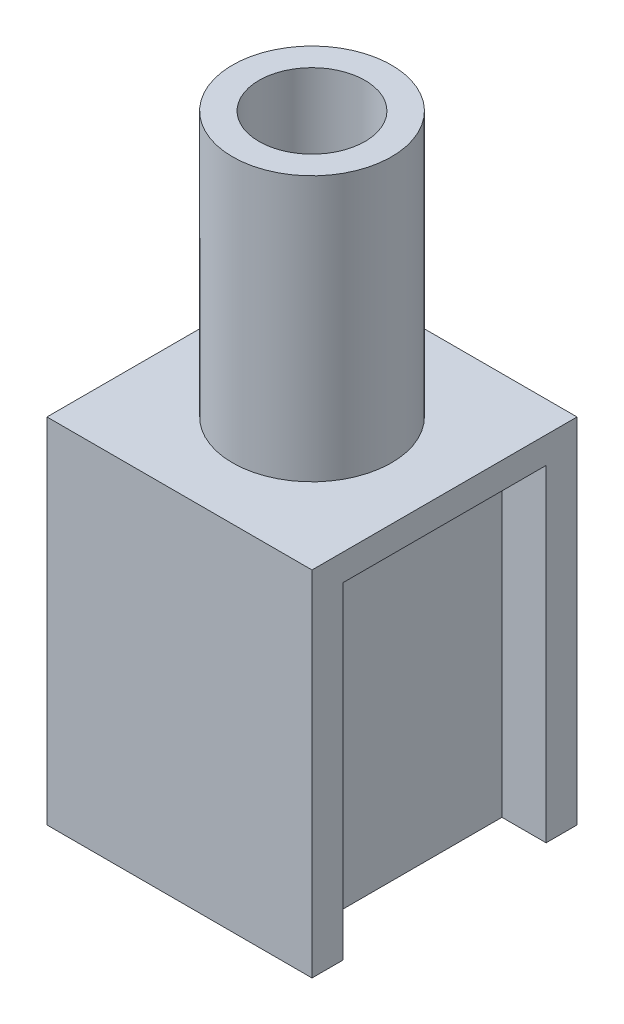
ISO-10303-21;
HEADER;
FILE_DESCRIPTION(('STEP AP214'),'2;1');
FILE_NAME('part.step','',(''),(''),'','','');
FILE_SCHEMA(('AUTOMOTIVE_DESIGN { 1 0 10303 214 1 1 1 1 }'));
ENDSEC;
DATA;
#1=APPLICATION_CONTEXT('core data for automotive mechanical design processes');
#2=APPLICATION_PROTOCOL_DEFINITION('international standard','automotive_design',2000,#1);
#3=PRODUCT_CONTEXT('',#1,'mechanical');
#4=PRODUCT('Part','Part','',(#3));
#5=PRODUCT_RELATED_PRODUCT_CATEGORY('part','',(#4));
#6=PRODUCT_DEFINITION_FORMATION('','',#4);
#7=PRODUCT_DEFINITION_CONTEXT('part definition',#1,'design');
#8=PRODUCT_DEFINITION('design','',#6,#7);
#9=PRODUCT_DEFINITION_SHAPE('','',#8);
#10=(LENGTH_UNIT() NAMED_UNIT(*) SI_UNIT(.MILLI.,.METRE.));
#11=(NAMED_UNIT(*) PLANE_ANGLE_UNIT() SI_UNIT($,.RADIAN.));
#12=(NAMED_UNIT(*) SI_UNIT($,.STERADIAN.) SOLID_ANGLE_UNIT());
#13=UNCERTAINTY_MEASURE_WITH_UNIT(LENGTH_MEASURE(1.E-05),#10,'distance_accuracy_value','');
#14=(GEOMETRIC_REPRESENTATION_CONTEXT(3) GLOBAL_UNCERTAINTY_ASSIGNED_CONTEXT((#13)) GLOBAL_UNIT_ASSIGNED_CONTEXT((#10,
#11,#12)) REPRESENTATION_CONTEXT('',''));
#15=CARTESIAN_POINT('',(0.,0.,0.));
#16=DIRECTION('',(0.,0.,1.));
#17=DIRECTION('',(1.,0.,0.));
#18=AXIS2_PLACEMENT_3D('',#15,#16,#17);
#19=CARTESIAN_POINT('',(0.,0.,0.));
#20=DIRECTION('',(0.,-1.,0.));
#21=DIRECTION('',(0.,0.,-1.));
#22=AXIS2_PLACEMENT_3D('',#19,#20,#21);
#23=PLANE('',#22);
#24=DIRECTION('',(0.,0.,1.));
#25=VECTOR('',#24,1.);
#26=CARTESIAN_POINT('',(-9.99999999999999,0.,-11.5));
#27=LINE('',#26,#25);
#28=CARTESIAN_POINT('',(-9.99999999999999,0.,-11.5));
#29=VERTEX_POINT('',#28);
#30=CARTESIAN_POINT('',(-9.99999999999999,0.,11.5));
#31=VERTEX_POINT('',#30);
#32=EDGE_CURVE('E140',#29,#31,#27,.T.);
#33=ORIENTED_EDGE('',*,*,#32,.F.);
#34=DIRECTION('',(-1.,0.,0.));
#35=VECTOR('',#34,1.);
#36=CARTESIAN_POINT('',(-9.99999999999999,0.,-11.5));
#37=LINE('',#36,#35);
#38=CARTESIAN_POINT('',(-15.,0.,-11.5));
#39=VERTEX_POINT('',#38);
#40=EDGE_CURVE('E162',#29,#39,#37,.T.);
#41=ORIENTED_EDGE('',*,*,#40,.T.);
#42=DIRECTION('',(0.,0.,1.));
#43=VECTOR('',#42,1.);
#44=CARTESIAN_POINT('',(-15.,0.,15.));
#45=LINE('',#44,#43);
#46=CARTESIAN_POINT('',(-15.,0.,-15.));
#47=VERTEX_POINT('',#46);
#48=EDGE_CURVE('E217',#47,#39,#45,.T.);
#49=ORIENTED_EDGE('',*,*,#48,.F.);
#50=DIRECTION('',(-1.,0.,0.));
#51=VECTOR('',#50,1.);
#52=CARTESIAN_POINT('',(-15.,0.,-15.));
#53=LINE('',#52,#51);
#54=CARTESIAN_POINT('',(15.,0.,-15.));
#55=VERTEX_POINT('',#54);
#56=EDGE_CURVE('E214',#55,#47,#53,.T.);
#57=ORIENTED_EDGE('',*,*,#56,.F.);
#58=DIRECTION('',(0.,0.,-1.));
#59=VECTOR('',#58,1.);
#60=CARTESIAN_POINT('',(15.,0.,15.));
#61=LINE('',#60,#59);
#62=CARTESIAN_POINT('',(15.,0.,-11.5));
#63=VERTEX_POINT('',#62);
#64=EDGE_CURVE('E200',#63,#55,#61,.T.);
#65=ORIENTED_EDGE('',*,*,#64,.F.);
#66=DIRECTION('',(1.,0.,0.));
#67=VECTOR('',#66,1.);
#68=CARTESIAN_POINT('',(10.,0.,-11.5));
#69=LINE('',#68,#67);
#70=CARTESIAN_POINT('',(10.,0.,-11.5));
#71=VERTEX_POINT('',#70);
#72=EDGE_CURVE('E181',#71,#63,#69,.T.);
#73=ORIENTED_EDGE('',*,*,#72,.F.);
#74=DIRECTION('',(0.,0.,-1.));
#75=VECTOR('',#74,1.);
#76=CARTESIAN_POINT('',(10.,0.,11.5));
#77=LINE('',#76,#75);
#78=CARTESIAN_POINT('',(10.,0.,11.5));
#79=VERTEX_POINT('',#78);
#80=EDGE_CURVE('E175',#79,#71,#77,.T.);
#81=ORIENTED_EDGE('',*,*,#80,.F.);
#82=DIRECTION('',(1.,0.,0.));
#83=VECTOR('',#82,1.);
#84=CARTESIAN_POINT('',(10.,0.,11.5));
#85=LINE('',#84,#83);
#86=CARTESIAN_POINT('',(15.,0.,11.5));
#87=VERTEX_POINT('',#86);
#88=EDGE_CURVE('E188',#79,#87,#85,.T.);
#89=ORIENTED_EDGE('',*,*,#88,.T.);
#90=CARTESIAN_POINT('',(15.,0.,15.));
#91=VERTEX_POINT('',#90);
#92=EDGE_CURVE('E215',#91,#87,#61,.T.);
#93=ORIENTED_EDGE('',*,*,#92,.F.);
#94=DIRECTION('',(1.,0.,0.));
#95=VECTOR('',#94,1.);
#96=CARTESIAN_POINT('',(-15.,0.,15.));
#97=LINE('',#96,#95);
#98=CARTESIAN_POINT('',(-15.,0.,15.));
#99=VERTEX_POINT('',#98);
#100=EDGE_CURVE('E202',#99,#91,#97,.T.);
#101=ORIENTED_EDGE('',*,*,#100,.F.);
#102=CARTESIAN_POINT('',(-15.,0.,11.5));
#103=VERTEX_POINT('',#102);
#104=EDGE_CURVE('E220',#103,#99,#45,.T.);
#105=ORIENTED_EDGE('',*,*,#104,.F.);
#106=DIRECTION('',(-1.,0.,0.));
#107=VECTOR('',#106,1.);
#108=CARTESIAN_POINT('',(-9.99999999999999,0.,11.5));
#109=LINE('',#108,#107);
#110=EDGE_CURVE('E159',#31,#103,#109,.T.);
#111=ORIENTED_EDGE('',*,*,#110,.F.);
#112=EDGE_LOOP('',(#33,#41,#49,#57,#65,#73,#81,#89,#93,#101,#105,#111));
#113=FACE_BOUND('',#112,.T.);
#114=ADVANCED_FACE('F39',(#113),#23,.T.);
#115=CARTESIAN_POINT('',(-15.,40.,15.));
#116=DIRECTION('',(1.,0.,0.));
#117=DIRECTION('',(0.,0.,-1.));
#118=AXIS2_PLACEMENT_3D('',#115,#116,#117);
#119=PLANE('',#118);
#120=DIRECTION('',(0.,1.,0.));
#121=VECTOR('',#120,1.);
#122=CARTESIAN_POINT('',(-15.,0.,11.5));
#123=LINE('',#122,#121);
#124=CARTESIAN_POINT('',(-15.,37.,11.5));
#125=VERTEX_POINT('',#124);
#126=EDGE_CURVE('E54',#103,#125,#123,.T.);
#127=ORIENTED_EDGE('',*,*,#126,.F.);
#128=ORIENTED_EDGE('',*,*,#104,.T.);
#129=DIRECTION('',(0.,-1.,0.));
#130=VECTOR('',#129,1.);
#131=CARTESIAN_POINT('',(-15.,40.,15.));
#132=LINE('',#131,#130);
#133=CARTESIAN_POINT('',(-15.,40.,15.));
#134=VERTEX_POINT('',#133);
#135=EDGE_CURVE('E221',#134,#99,#132,.T.);
#136=ORIENTED_EDGE('',*,*,#135,.F.);
#137=DIRECTION('',(0.,0.,1.));
#138=VECTOR('',#137,1.);
#139=CARTESIAN_POINT('',(-15.,40.,15.));
#140=LINE('',#139,#138);
#141=CARTESIAN_POINT('',(-15.,40.,-15.));
#142=VERTEX_POINT('',#141);
#143=EDGE_CURVE('E210',#142,#134,#140,.T.);
#144=ORIENTED_EDGE('',*,*,#143,.F.);
#145=DIRECTION('',(0.,-1.,0.));
#146=VECTOR('',#145,1.);
#147=CARTESIAN_POINT('',(-15.,40.,-15.));
#148=LINE('',#147,#146);
#149=EDGE_CURVE('E228',#142,#47,#148,.T.);
#150=ORIENTED_EDGE('',*,*,#149,.T.);
#151=ORIENTED_EDGE('',*,*,#48,.T.);
#152=DIRECTION('',(0.,-1.,0.));
#153=VECTOR('',#152,1.);
#154=CARTESIAN_POINT('',(-15.,0.,-11.5));
#155=LINE('',#154,#153);
#156=CARTESIAN_POINT('',(-15.,37.,-11.5));
#157=VERTEX_POINT('',#156);
#158=EDGE_CURVE('E151',#157,#39,#155,.T.);
#159=ORIENTED_EDGE('',*,*,#158,.F.);
#160=DIRECTION('',(0.,0.,-1.));
#161=VECTOR('',#160,1.);
#162=CARTESIAN_POINT('',(-15.,37.,-11.5));
#163=LINE('',#162,#161);
#164=EDGE_CURVE('E153',#125,#157,#163,.T.);
#165=ORIENTED_EDGE('',*,*,#164,.F.);
#166=EDGE_LOOP('',(#127,#128,#136,#144,#150,#151,#159,#165));
#167=FACE_BOUND('',#166,.T.);
#168=ADVANCED_FACE('F241',(#167),#119,.F.);
#169=CARTESIAN_POINT('',(15.,40.,15.));
#170=DIRECTION('',(-1.,0.,0.));
#171=DIRECTION('',(0.,0.,1.));
#172=AXIS2_PLACEMENT_3D('',#169,#170,#171);
#173=PLANE('',#172);
#174=DIRECTION('',(0.,1.,0.));
#175=VECTOR('',#174,1.);
#176=CARTESIAN_POINT('',(15.,0.,-11.5));
#177=LINE('',#176,#175);
#178=CARTESIAN_POINT('',(15.,37.,-11.5));
#179=VERTEX_POINT('',#178);
#180=EDGE_CURVE('E165',#63,#179,#177,.T.);
#181=ORIENTED_EDGE('',*,*,#180,.F.);
#182=ORIENTED_EDGE('',*,*,#64,.T.);
#183=DIRECTION('',(0.,-1.,0.));
#184=VECTOR('',#183,1.);
#185=CARTESIAN_POINT('',(15.,40.,-15.));
#186=LINE('',#185,#184);
#187=CARTESIAN_POINT('',(15.,40.,-15.));
#188=VERTEX_POINT('',#187);
#189=EDGE_CURVE('E43',#188,#55,#186,.T.);
#190=ORIENTED_EDGE('',*,*,#189,.F.);
#191=DIRECTION('',(0.,0.,-1.));
#192=VECTOR('',#191,1.);
#193=CARTESIAN_POINT('',(15.,40.,15.));
#194=LINE('',#193,#192);
#195=CARTESIAN_POINT('',(15.,40.,15.));
#196=VERTEX_POINT('',#195);
#197=EDGE_CURVE('E203',#196,#188,#194,.T.);
#198=ORIENTED_EDGE('',*,*,#197,.F.);
#199=DIRECTION('',(0.,-1.,0.));
#200=VECTOR('',#199,1.);
#201=CARTESIAN_POINT('',(15.,40.,15.));
#202=LINE('',#201,#200);
#203=EDGE_CURVE('E211',#196,#91,#202,.T.);
#204=ORIENTED_EDGE('',*,*,#203,.T.);
#205=ORIENTED_EDGE('',*,*,#92,.T.);
#206=DIRECTION('',(0.,-1.,0.));
#207=VECTOR('',#206,1.);
#208=CARTESIAN_POINT('',(15.,0.,11.5));
#209=LINE('',#208,#207);
#210=CARTESIAN_POINT('',(15.,37.,11.5));
#211=VERTEX_POINT('',#210);
#212=EDGE_CURVE('E173',#211,#87,#209,.T.);
#213=ORIENTED_EDGE('',*,*,#212,.F.);
#214=DIRECTION('',(0.,0.,1.));
#215=VECTOR('',#214,1.);
#216=CARTESIAN_POINT('',(15.,37.,11.5));
#217=LINE('',#216,#215);
#218=EDGE_CURVE('E178',#179,#211,#217,.T.);
#219=ORIENTED_EDGE('',*,*,#218,.F.);
#220=EDGE_LOOP('',(#181,#182,#190,#198,#204,#205,#213,#219));
#221=FACE_BOUND('',#220,.T.);
#222=ADVANCED_FACE('F41',(#221),#173,.F.);
#223=CARTESIAN_POINT('',(-15.,40.,-15.));
#224=DIRECTION('',(0.,0.,1.));
#225=DIRECTION('',(1.,0.,0.));
#226=AXIS2_PLACEMENT_3D('',#223,#224,#225);
#227=PLANE('',#226);
#228=ORIENTED_EDGE('',*,*,#56,.T.);
#229=ORIENTED_EDGE('',*,*,#149,.F.);
#230=DIRECTION('',(-1.,0.,0.));
#231=VECTOR('',#230,1.);
#232=CARTESIAN_POINT('',(-15.,40.,-15.));
#233=LINE('',#232,#231);
#234=EDGE_CURVE('E204',#188,#142,#233,.T.);
#235=ORIENTED_EDGE('',*,*,#234,.F.);
#236=ORIENTED_EDGE('',*,*,#189,.T.);
#237=EDGE_LOOP('',(#228,#229,#235,#236));
#238=FACE_BOUND('',#237,.T.);
#239=ADVANCED_FACE('F232',(#238),#227,.F.);
#240=CARTESIAN_POINT('',(-15.,40.,15.));
#241=DIRECTION('',(0.,0.,-1.));
#242=DIRECTION('',(-1.,0.,0.));
#243=AXIS2_PLACEMENT_3D('',#240,#241,#242);
#244=PLANE('',#243);
#245=ORIENTED_EDGE('',*,*,#100,.T.);
#246=ORIENTED_EDGE('',*,*,#203,.F.);
#247=DIRECTION('',(1.,0.,0.));
#248=VECTOR('',#247,1.);
#249=CARTESIAN_POINT('',(-15.,40.,15.));
#250=LINE('',#249,#248);
#251=EDGE_CURVE('E207',#134,#196,#250,.T.);
#252=ORIENTED_EDGE('',*,*,#251,.F.);
#253=ORIENTED_EDGE('',*,*,#135,.T.);
#254=EDGE_LOOP('',(#245,#246,#252,#253));
#255=FACE_BOUND('',#254,.T.);
#256=ADVANCED_FACE('F251',(#255),#244,.F.);
#257=CARTESIAN_POINT('',(0.,40.,0.));
#258=DIRECTION('',(0.,-1.,0.));
#259=DIRECTION('',(0.,0.,-1.));
#260=AXIS2_PLACEMENT_3D('',#257,#258,#259);
#261=PLANE('',#260);
#262=CARTESIAN_POINT('',(0.,40.,0.));
#263=DIRECTION('',(0.,1.,0.));
#264=DIRECTION('',(0.,0.,1.));
#265=AXIS2_PLACEMENT_3D('',#262,#263,#264);
#266=CIRCLE('',#265,9.);
#267=CARTESIAN_POINT('',(0.,40.,9.));
#268=VERTEX_POINT('',#267);
#269=EDGE_CURVE('E11',#268,#268,#266,.T.);
#270=ORIENTED_EDGE('',*,*,#269,.F.);
#271=EDGE_LOOP('',(#270));
#272=FACE_BOUND('',#271,.T.);
#273=ORIENTED_EDGE('',*,*,#197,.T.);
#274=ORIENTED_EDGE('',*,*,#234,.T.);
#275=ORIENTED_EDGE('',*,*,#143,.T.);
#276=ORIENTED_EDGE('',*,*,#251,.T.);
#277=EDGE_LOOP('',(#273,#274,#275,#276));
#278=FACE_BOUND('',#277,.T.);
#279=ADVANCED_FACE('F282',(#272,#278),#261,.F.);
#280=CARTESIAN_POINT('',(0.,70.,0.));
#281=DIRECTION('',(0.,-1.,0.));
#282=DIRECTION('',(0.,0.,-1.));
#283=AXIS2_PLACEMENT_3D('',#280,#281,#282);
#284=CYLINDRICAL_SURFACE('',#283,9.);
#285=CARTESIAN_POINT('',(0.,70.,0.));
#286=DIRECTION('',(0.,1.,0.));
#287=DIRECTION('',(0.,0.,1.));
#288=AXIS2_PLACEMENT_3D('',#285,#286,#287);
#289=CIRCLE('',#288,9.);
#290=CARTESIAN_POINT('',(0.,70.,9.));
#291=VERTEX_POINT('',#290);
#292=EDGE_CURVE('E192',#291,#291,#289,.T.);
#293=ORIENTED_EDGE('',*,*,#292,.F.);
#294=EDGE_LOOP('',(#293));
#295=FACE_BOUND('',#294,.T.);
#296=ORIENTED_EDGE('',*,*,#269,.T.);
#297=EDGE_LOOP('',(#296));
#298=FACE_BOUND('',#297,.T.);
#299=ADVANCED_FACE('F373',(#295,#298),#284,.T.);
#300=CARTESIAN_POINT('',(0.,70.,0.));
#301=DIRECTION('',(0.,1.,0.));
#302=DIRECTION('',(0.,0.,1.));
#303=AXIS2_PLACEMENT_3D('',#300,#301,#302);
#304=PLANE('',#303);
#305=CARTESIAN_POINT('',(0.,70.,0.));
#306=DIRECTION('',(0.,1.,0.));
#307=DIRECTION('',(0.,0.,1.));
#308=AXIS2_PLACEMENT_3D('',#305,#306,#307);
#309=CIRCLE('',#308,6.);
#310=CARTESIAN_POINT('',(0.,70.,6.));
#311=VERTEX_POINT('',#310);
#312=EDGE_CURVE('E183',#311,#311,#309,.T.);
#313=ORIENTED_EDGE('',*,*,#312,.F.);
#314=EDGE_LOOP('',(#313));
#315=FACE_BOUND('',#314,.T.);
#316=ORIENTED_EDGE('',*,*,#292,.T.);
#317=EDGE_LOOP('',(#316));
#318=FACE_BOUND('',#317,.T.);
#319=ADVANCED_FACE('F367',(#315,#318),#304,.T.);
#320=CARTESIAN_POINT('',(0.,10.,0.));
#321=DIRECTION('',(0.,1.,0.));
#322=DIRECTION('',(0.,0.,1.));
#323=AXIS2_PLACEMENT_3D('',#320,#321,#322);
#324=CYLINDRICAL_SURFACE('',#323,6.);
#325=CARTESIAN_POINT('',(0.,10.,0.));
#326=DIRECTION('',(0.,1.,0.));
#327=DIRECTION('',(0.,0.,1.));
#328=AXIS2_PLACEMENT_3D('',#325,#326,#327);
#329=CIRCLE('',#328,6.);
#330=CARTESIAN_POINT('',(0.,10.,6.));
#331=VERTEX_POINT('',#330);
#332=EDGE_CURVE('E191',#331,#331,#329,.T.);
#333=ORIENTED_EDGE('',*,*,#332,.F.);
#334=EDGE_LOOP('',(#333));
#335=FACE_BOUND('',#334,.T.);
#336=ORIENTED_EDGE('',*,*,#312,.T.);
#337=EDGE_LOOP('',(#336));
#338=FACE_BOUND('',#337,.T.);
#339=ADVANCED_FACE('F370',(#335,#338),#324,.F.);
#340=CARTESIAN_POINT('',(0.,10.,0.));
#341=DIRECTION('',(0.,1.,0.));
#342=DIRECTION('',(0.,0.,1.));
#343=AXIS2_PLACEMENT_3D('',#340,#341,#342);
#344=PLANE('',#343);
#345=ORIENTED_EDGE('',*,*,#332,.T.);
#346=EDGE_LOOP('',(#345));
#347=FACE_BOUND('',#346,.T.);
#348=ADVANCED_FACE('F297',(#347),#344,.T.);
#349=CARTESIAN_POINT('',(10.,0.,-11.5));
#350=DIRECTION('',(0.,0.,-1.));
#351=DIRECTION('',(0.,1.,0.));
#352=AXIS2_PLACEMENT_3D('',#349,#350,#351);
#353=PLANE('',#352);
#354=ORIENTED_EDGE('',*,*,#180,.T.);
#355=DIRECTION('',(1.,0.,0.));
#356=VECTOR('',#355,1.);
#357=CARTESIAN_POINT('',(10.,37.,-11.5));
#358=LINE('',#357,#356);
#359=CARTESIAN_POINT('',(10.,37.,-11.5));
#360=VERTEX_POINT('',#359);
#361=EDGE_CURVE('E179',#360,#179,#358,.T.);
#362=ORIENTED_EDGE('',*,*,#361,.F.);
#363=DIRECTION('',(0.,1.,0.));
#364=VECTOR('',#363,1.);
#365=CARTESIAN_POINT('',(10.,0.,-11.5));
#366=LINE('',#365,#364);
#367=EDGE_CURVE('E170',#71,#360,#366,.T.);
#368=ORIENTED_EDGE('',*,*,#367,.F.);
#369=ORIENTED_EDGE('',*,*,#72,.T.);
#370=EDGE_LOOP('',(#354,#362,#368,#369));
#371=FACE_BOUND('',#370,.T.);
#372=ADVANCED_FACE('F262',(#371),#353,.F.);
#373=CARTESIAN_POINT('',(10.,0.,11.5));
#374=DIRECTION('',(0.,0.,1.));
#375=DIRECTION('',(0.,-1.,0.));
#376=AXIS2_PLACEMENT_3D('',#373,#374,#375);
#377=PLANE('',#376);
#378=ORIENTED_EDGE('',*,*,#212,.T.);
#379=ORIENTED_EDGE('',*,*,#88,.F.);
#380=DIRECTION('',(0.,-1.,0.));
#381=VECTOR('',#380,1.);
#382=CARTESIAN_POINT('',(10.,0.,11.5));
#383=LINE('',#382,#381);
#384=CARTESIAN_POINT('',(10.,37.,11.5));
#385=VERTEX_POINT('',#384);
#386=EDGE_CURVE('E62',#385,#79,#383,.T.);
#387=ORIENTED_EDGE('',*,*,#386,.F.);
#388=DIRECTION('',(1.,0.,0.));
#389=VECTOR('',#388,1.);
#390=CARTESIAN_POINT('',(10.,37.,11.5));
#391=LINE('',#390,#389);
#392=EDGE_CURVE('E190',#385,#211,#391,.T.);
#393=ORIENTED_EDGE('',*,*,#392,.T.);
#394=EDGE_LOOP('',(#378,#379,#387,#393));
#395=FACE_BOUND('',#394,.T.);
#396=ADVANCED_FACE('F259',(#395),#377,.F.);
#397=CARTESIAN_POINT('',(10.,37.,11.5));
#398=DIRECTION('',(0.,1.,0.));
#399=DIRECTION('',(0.,0.,1.));
#400=AXIS2_PLACEMENT_3D('',#397,#398,#399);
#401=PLANE('',#400);
#402=ORIENTED_EDGE('',*,*,#218,.T.);
#403=ORIENTED_EDGE('',*,*,#392,.F.);
#404=DIRECTION('',(0.,0.,1.));
#405=VECTOR('',#404,1.);
#406=CARTESIAN_POINT('',(10.,37.,11.5));
#407=LINE('',#406,#405);
#408=EDGE_CURVE('E168',#360,#385,#407,.T.);
#409=ORIENTED_EDGE('',*,*,#408,.F.);
#410=ORIENTED_EDGE('',*,*,#361,.T.);
#411=EDGE_LOOP('',(#402,#403,#409,#410));
#412=FACE_BOUND('',#411,.T.);
#413=ADVANCED_FACE('F265',(#412),#401,.F.);
#414=CARTESIAN_POINT('',(10.,0.,0.));
#415=DIRECTION('',(-1.,0.,0.));
#416=DIRECTION('',(0.,0.,1.));
#417=AXIS2_PLACEMENT_3D('',#414,#415,#416);
#418=PLANE('',#417);
#419=ORIENTED_EDGE('',*,*,#367,.T.);
#420=ORIENTED_EDGE('',*,*,#408,.T.);
#421=ORIENTED_EDGE('',*,*,#386,.T.);
#422=ORIENTED_EDGE('',*,*,#80,.T.);
#423=EDGE_LOOP('',(#419,#420,#421,#422));
#424=FACE_BOUND('',#423,.T.);
#425=ADVANCED_FACE('F264',(#424),#418,.F.);
#426=CARTESIAN_POINT('',(-9.99999999999999,0.,11.5));
#427=DIRECTION('',(0.,0.,1.));
#428=DIRECTION('',(0.,-1.,0.));
#429=AXIS2_PLACEMENT_3D('',#426,#427,#428);
#430=PLANE('',#429);
#431=ORIENTED_EDGE('',*,*,#126,.T.);
#432=DIRECTION('',(-1.,0.,0.));
#433=VECTOR('',#432,1.);
#434=CARTESIAN_POINT('',(-9.99999999999999,37.,11.5));
#435=LINE('',#434,#433);
#436=CARTESIAN_POINT('',(-9.99999999999999,37.,11.5));
#437=VERTEX_POINT('',#436);
#438=EDGE_CURVE('E126',#437,#125,#435,.T.);
#439=ORIENTED_EDGE('',*,*,#438,.F.);
#440=DIRECTION('',(0.,1.,0.));
#441=VECTOR('',#440,1.);
#442=CARTESIAN_POINT('',(-9.99999999999999,0.,11.5));
#443=LINE('',#442,#441);
#444=EDGE_CURVE('E134',#31,#437,#443,.T.);
#445=ORIENTED_EDGE('',*,*,#444,.F.);
#446=ORIENTED_EDGE('',*,*,#110,.T.);
#447=EDGE_LOOP('',(#431,#439,#445,#446));
#448=FACE_BOUND('',#447,.T.);
#449=ADVANCED_FACE('F128',(#448),#430,.F.);
#450=CARTESIAN_POINT('',(-9.99999999999999,0.,-11.5));
#451=DIRECTION('',(0.,0.,-1.));
#452=DIRECTION('',(-1.,0.,0.));
#453=AXIS2_PLACEMENT_3D('',#450,#451,#452);
#454=PLANE('',#453);
#455=ORIENTED_EDGE('',*,*,#158,.T.);
#456=ORIENTED_EDGE('',*,*,#40,.F.);
#457=DIRECTION('',(0.,-1.,0.));
#458=VECTOR('',#457,1.);
#459=CARTESIAN_POINT('',(-9.99999999999999,0.,-11.5));
#460=LINE('',#459,#458);
#461=CARTESIAN_POINT('',(-9.99999999999999,37.,-11.5));
#462=VERTEX_POINT('',#461);
#463=EDGE_CURVE('E148',#462,#29,#460,.T.);
#464=ORIENTED_EDGE('',*,*,#463,.F.);
#465=DIRECTION('',(-1.,0.,0.));
#466=VECTOR('',#465,1.);
#467=CARTESIAN_POINT('',(-9.99999999999999,37.,-11.5));
#468=LINE('',#467,#466);
#469=EDGE_CURVE('E136',#462,#157,#468,.T.);
#470=ORIENTED_EDGE('',*,*,#469,.T.);
#471=EDGE_LOOP('',(#455,#456,#464,#470));
#472=FACE_BOUND('',#471,.T.);
#473=ADVANCED_FACE('F246',(#472),#454,.F.);
#474=CARTESIAN_POINT('',(-9.99999999999999,37.,-11.5));
#475=DIRECTION('',(0.,1.,0.));
#476=DIRECTION('',(0.,0.,1.));
#477=AXIS2_PLACEMENT_3D('',#474,#475,#476);
#478=PLANE('',#477);
#479=ORIENTED_EDGE('',*,*,#164,.T.);
#480=ORIENTED_EDGE('',*,*,#469,.F.);
#481=DIRECTION('',(0.,0.,-1.));
#482=VECTOR('',#481,1.);
#483=CARTESIAN_POINT('',(-9.99999999999999,37.,-11.5));
#484=LINE('',#483,#482);
#485=EDGE_CURVE('E143',#437,#462,#484,.T.);
#486=ORIENTED_EDGE('',*,*,#485,.F.);
#487=ORIENTED_EDGE('',*,*,#438,.T.);
#488=EDGE_LOOP('',(#479,#480,#486,#487));
#489=FACE_BOUND('',#488,.T.);
#490=ADVANCED_FACE('F142',(#489),#478,.F.);
#491=CARTESIAN_POINT('',(-9.99999999999999,0.,0.));
#492=DIRECTION('',(1.,0.,0.));
#493=DIRECTION('',(0.,0.,-1.));
#494=AXIS2_PLACEMENT_3D('',#491,#492,#493);
#495=PLANE('',#494);
#496=ORIENTED_EDGE('',*,*,#444,.T.);
#497=ORIENTED_EDGE('',*,*,#485,.T.);
#498=ORIENTED_EDGE('',*,*,#463,.T.);
#499=ORIENTED_EDGE('',*,*,#32,.T.);
#500=EDGE_LOOP('',(#496,#497,#498,#499));
#501=FACE_BOUND('',#500,.T.);
#502=ADVANCED_FACE('F146',(#501),#495,.F.);
#503=CLOSED_SHELL('',(#114,#168,#222,#239,#256,#279,#299,#319,#339,#348,#372,#396,#413,#425,
#449,#473,#490,#502));
#504=MANIFOLD_SOLID_BREP('B2',#503);
#505=ADVANCED_BREP_SHAPE_REPRESENTATION('',(#18,#504),#14);
#506=SHAPE_DEFINITION_REPRESENTATION(#9,#505);
ENDSEC;
END-ISO-10303-21;
